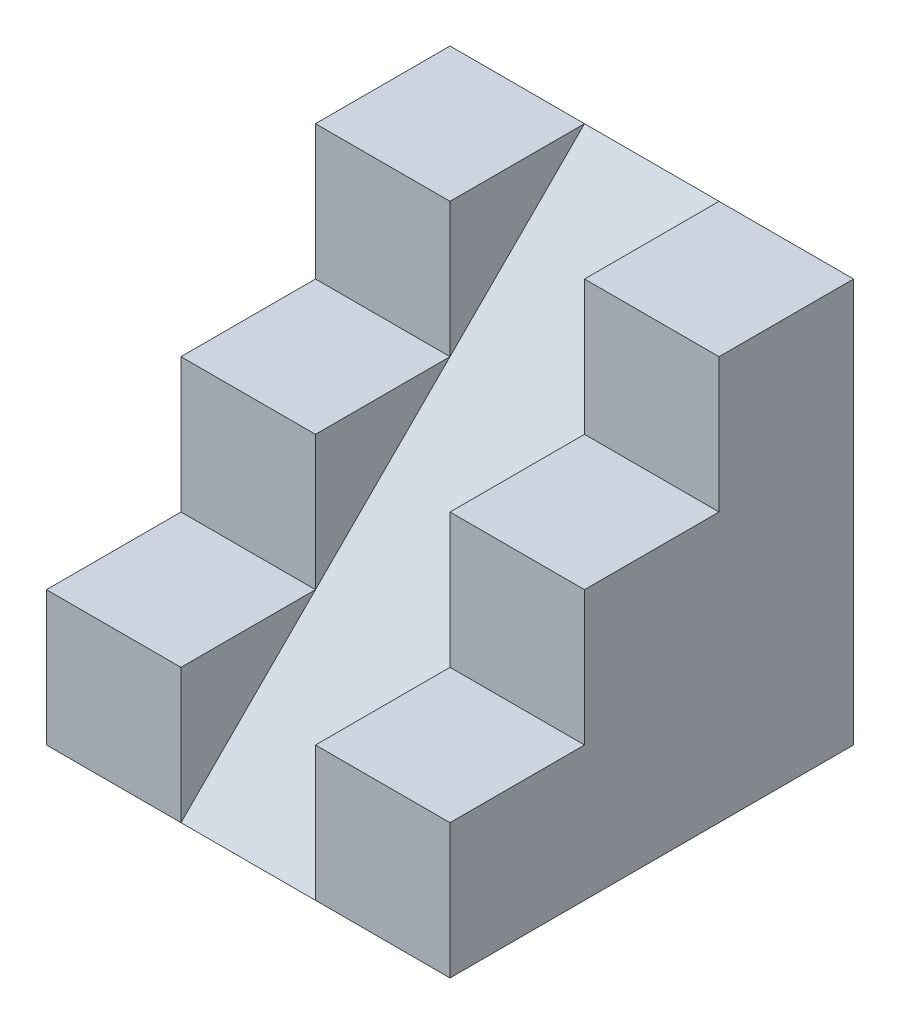
ISO-10303-21;
HEADER;
FILE_DESCRIPTION(('STEP AP214'),'2;1');
FILE_NAME('part.step','',(''),(''),'','','');
FILE_SCHEMA(('AUTOMOTIVE_DESIGN { 1 0 10303 214 1 1 1 1 }'));
ENDSEC;
DATA;
#1=APPLICATION_CONTEXT('core data for automotive mechanical design processes');
#2=APPLICATION_PROTOCOL_DEFINITION('international standard','automotive_design',2000,#1);
#3=PRODUCT_CONTEXT('',#1,'mechanical');
#4=PRODUCT('Part','Part','',(#3));
#5=PRODUCT_RELATED_PRODUCT_CATEGORY('part','',(#4));
#6=PRODUCT_DEFINITION_FORMATION('','',#4);
#7=PRODUCT_DEFINITION_CONTEXT('part definition',#1,'design');
#8=PRODUCT_DEFINITION('design','',#6,#7);
#9=PRODUCT_DEFINITION_SHAPE('','',#8);
#10=(LENGTH_UNIT() NAMED_UNIT(*) SI_UNIT(.MILLI.,.METRE.));
#11=(NAMED_UNIT(*) PLANE_ANGLE_UNIT() SI_UNIT($,.RADIAN.));
#12=(NAMED_UNIT(*) SI_UNIT($,.STERADIAN.) SOLID_ANGLE_UNIT());
#13=UNCERTAINTY_MEASURE_WITH_UNIT(LENGTH_MEASURE(1.E-05),#10,'distance_accuracy_value','');
#14=(GEOMETRIC_REPRESENTATION_CONTEXT(3) GLOBAL_UNCERTAINTY_ASSIGNED_CONTEXT((#13)) GLOBAL_UNIT_ASSIGNED_CONTEXT((#10,
#11,#12)) REPRESENTATION_CONTEXT('',''));
#15=CARTESIAN_POINT('',(0.,0.,0.));
#16=DIRECTION('',(0.,0.,1.));
#17=DIRECTION('',(1.,0.,0.));
#18=AXIS2_PLACEMENT_3D('',#15,#16,#17);
#19=CARTESIAN_POINT('',(10.,0.,30.));
#20=DIRECTION('',(1.,0.,0.));
#21=DIRECTION('',(0.,0.,-1.));
#22=AXIS2_PLACEMENT_3D('',#19,#20,#21);
#23=PLANE('',#22);
#24=DIRECTION('',(0.,1.,0.));
#25=VECTOR('',#24,1.);
#26=CARTESIAN_POINT('',(10.,0.,-30.));
#27=LINE('',#26,#25);
#28=CARTESIAN_POINT('',(10.,0.,-30.));
#29=VERTEX_POINT('',#28);
#30=CARTESIAN_POINT('',(10.,60.,-30.));
#31=VERTEX_POINT('',#30);
#32=EDGE_CURVE('E89',#29,#31,#27,.T.);
#33=ORIENTED_EDGE('',*,*,#32,.T.);
#34=DIRECTION('',(0.,0.707106781186547,-0.707106781186548));
#35=VECTOR('',#34,1.);
#36=CARTESIAN_POINT('',(10.,0.,30.));
#37=LINE('',#36,#35);
#38=CARTESIAN_POINT('',(10.,0.,30.));
#39=VERTEX_POINT('',#38);
#40=EDGE_CURVE('E62',#31,#39,#37,.F.);
#41=ORIENTED_EDGE('',*,*,#40,.T.);
#42=DIRECTION('',(0.,0.,-1.));
#43=VECTOR('',#42,1.);
#44=CARTESIAN_POINT('',(10.,0.,30.));
#45=LINE('',#44,#43);
#46=EDGE_CURVE('E103',#39,#29,#45,.T.);
#47=ORIENTED_EDGE('',*,*,#46,.T.);
#48=EDGE_LOOP('',(#33,#41,#47));
#49=FACE_BOUND('',#48,.T.);
#50=ADVANCED_FACE('F52',(#49),#23,.T.);
#51=CARTESIAN_POINT('',(-10.,0.,-30.));
#52=DIRECTION('',(-1.,0.,0.));
#53=DIRECTION('',(0.,0.,1.));
#54=AXIS2_PLACEMENT_3D('',#51,#52,#53);
#55=PLANE('',#54);
#56=DIRECTION('',(0.,0.,1.));
#57=VECTOR('',#56,1.);
#58=CARTESIAN_POINT('',(-10.,0.,-30.));
#59=LINE('',#58,#57);
#60=CARTESIAN_POINT('',(-10.,0.,-30.));
#61=VERTEX_POINT('',#60);
#62=CARTESIAN_POINT('',(-10.,0.,30.));
#63=VERTEX_POINT('',#62);
#64=EDGE_CURVE('E94',#61,#63,#59,.T.);
#65=ORIENTED_EDGE('',*,*,#64,.T.);
#66=DIRECTION('',(0.,-0.707106781186547,0.707106781186548));
#67=VECTOR('',#66,1.);
#68=CARTESIAN_POINT('',(-10.,30.,0.));
#69=LINE('',#68,#67);
#70=CARTESIAN_POINT('',(-10.,60.,-30.));
#71=VERTEX_POINT('',#70);
#72=EDGE_CURVE('E12',#63,#71,#69,.F.);
#73=ORIENTED_EDGE('',*,*,#72,.T.);
#74=DIRECTION('',(0.,1.,0.));
#75=VECTOR('',#74,1.);
#76=CARTESIAN_POINT('',(-10.,0.,-30.));
#77=LINE('',#76,#75);
#78=EDGE_CURVE('E91',#61,#71,#77,.T.);
#79=ORIENTED_EDGE('',*,*,#78,.F.);
#80=EDGE_LOOP('',(#65,#73,#79));
#81=FACE_BOUND('',#80,.T.);
#82=ADVANCED_FACE('F93',(#81),#55,.T.);
#83=CARTESIAN_POINT('',(10.,0.,-30.));
#84=DIRECTION('',(0.,0.,-1.));
#85=DIRECTION('',(-1.,0.,0.));
#86=AXIS2_PLACEMENT_3D('',#83,#84,#85);
#87=PLANE('',#86);
#88=DIRECTION('',(-1.,0.,0.));
#89=VECTOR('',#88,1.);
#90=CARTESIAN_POINT('',(10.,60.,-30.));
#91=LINE('',#90,#89);
#92=EDGE_CURVE('E105',#31,#71,#91,.T.);
#93=ORIENTED_EDGE('',*,*,#92,.F.);
#94=ORIENTED_EDGE('',*,*,#32,.F.);
#95=DIRECTION('',(-1.,0.,0.));
#96=VECTOR('',#95,1.);
#97=CARTESIAN_POINT('',(10.,0.,-30.));
#98=LINE('',#97,#96);
#99=EDGE_CURVE('E99',#29,#61,#98,.T.);
#100=ORIENTED_EDGE('',*,*,#99,.T.);
#101=ORIENTED_EDGE('',*,*,#78,.T.);
#102=EDGE_LOOP('',(#93,#94,#100,#101));
#103=FACE_BOUND('',#102,.T.);
#104=ADVANCED_FACE('F102',(#103),#87,.T.);
#105=CARTESIAN_POINT('',(0.,0.,0.));
#106=DIRECTION('',(0.,1.,0.));
#107=DIRECTION('',(0.,0.,1.));
#108=AXIS2_PLACEMENT_3D('',#105,#106,#107);
#109=PLANE('',#108);
#110=ORIENTED_EDGE('',*,*,#46,.F.);
#111=DIRECTION('',(1.,0.,0.));
#112=VECTOR('',#111,1.);
#113=CARTESIAN_POINT('',(-10.,0.,30.));
#114=LINE('',#113,#112);
#115=EDGE_CURVE('E100',#63,#39,#114,.T.);
#116=ORIENTED_EDGE('',*,*,#115,.F.);
#117=ORIENTED_EDGE('',*,*,#64,.F.);
#118=ORIENTED_EDGE('',*,*,#99,.F.);
#119=EDGE_LOOP('',(#110,#116,#117,#118));
#120=FACE_BOUND('',#119,.T.);
#121=ADVANCED_FACE('F98',(#120),#109,.F.);
#122=CARTESIAN_POINT('',(0.,60.,-30.0000000000002));
#123=DIRECTION('',(0.,-0.707106781186548,-0.707106781186547));
#124=DIRECTION('',(1.,0.,0.));
#125=AXIS2_PLACEMENT_3D('',#122,#123,#124);
#126=PLANE('',#125);
#127=ORIENTED_EDGE('',*,*,#72,.F.);
#128=ORIENTED_EDGE('',*,*,#115,.T.);
#129=ORIENTED_EDGE('',*,*,#40,.F.);
#130=ORIENTED_EDGE('',*,*,#92,.T.);
#131=EDGE_LOOP('',(#127,#128,#129,#130));
#132=FACE_BOUND('',#131,.T.);
#133=ADVANCED_FACE('F55',(#132),#126,.F.);
#134=CLOSED_SHELL('',(#50,#82,#104,#121,#133));
#135=MANIFOLD_SOLID_BREP('B2',#134);
#136=CARTESIAN_POINT('',(0.,20.,0.));
#137=DIRECTION('',(0.,-1.,0.));
#138=DIRECTION('',(0.,0.,-1.));
#139=AXIS2_PLACEMENT_3D('',#136,#137,#138);
#140=PLANE('',#139);
#141=DIRECTION('',(1.,0.,0.));
#142=VECTOR('',#141,1.);
#143=CARTESIAN_POINT('',(10.,20.,9.99999999999999));
#144=LINE('',#143,#142);
#145=CARTESIAN_POINT('',(10.,20.,9.99999999999999));
#146=VERTEX_POINT('',#145);
#147=CARTESIAN_POINT('',(30.,20.,10.));
#148=VERTEX_POINT('',#147);
#149=EDGE_CURVE('E185',#146,#148,#144,.T.);
#150=ORIENTED_EDGE('',*,*,#149,.F.);
#151=DIRECTION('',(0.,0.,1.));
#152=VECTOR('',#151,1.);
#153=CARTESIAN_POINT('',(10.,20.,30.));
#154=LINE('',#153,#152);
#155=CARTESIAN_POINT('',(10.,20.,30.));
#156=VERTEX_POINT('',#155);
#157=EDGE_CURVE('E272',#146,#156,#154,.T.);
#158=ORIENTED_EDGE('',*,*,#157,.T.);
#159=DIRECTION('',(1.,0.,0.));
#160=VECTOR('',#159,1.);
#161=CARTESIAN_POINT('',(30.,20.,30.));
#162=LINE('',#161,#160);
#163=CARTESIAN_POINT('',(30.,20.,30.));
#164=VERTEX_POINT('',#163);
#165=EDGE_CURVE('E275',#156,#164,#162,.T.);
#166=ORIENTED_EDGE('',*,*,#165,.T.);
#167=DIRECTION('',(0.,0.,-1.));
#168=VECTOR('',#167,1.);
#169=CARTESIAN_POINT('',(30.,20.,-30.));
#170=LINE('',#169,#168);
#171=EDGE_CURVE('E270',#164,#148,#170,.T.);
#172=ORIENTED_EDGE('',*,*,#171,.T.);
#173=EDGE_LOOP('',(#150,#158,#166,#172));
#174=FACE_BOUND('',#173,.T.);
#175=ADVANCED_FACE('F162',(#174),#140,.F.);
#176=CARTESIAN_POINT('',(30.,20.,-30.));
#177=DIRECTION('',(-1.,0.,0.));
#178=DIRECTION('',(0.,0.,1.));
#179=AXIS2_PLACEMENT_3D('',#176,#177,#178);
#180=PLANE('',#179);
#181=DIRECTION('',(0.,0.,-1.));
#182=VECTOR('',#181,1.);
#183=CARTESIAN_POINT('',(30.,0.,-30.));
#184=LINE('',#183,#182);
#185=CARTESIAN_POINT('',(30.,0.,30.));
#186=VERTEX_POINT('',#185);
#187=CARTESIAN_POINT('',(30.,0.,-30.));
#188=VERTEX_POINT('',#187);
#189=EDGE_CURVE('E233',#186,#188,#184,.T.);
#190=ORIENTED_EDGE('',*,*,#189,.T.);
#191=DIRECTION('',(0.,-1.,0.));
#192=VECTOR('',#191,1.);
#193=CARTESIAN_POINT('',(30.,20.,-30.));
#194=LINE('',#193,#192);
#195=CARTESIAN_POINT('',(30.,60.,-30.));
#196=VERTEX_POINT('',#195);
#197=EDGE_CURVE('E50',#196,#188,#194,.T.);
#198=ORIENTED_EDGE('',*,*,#197,.F.);
#199=DIRECTION('',(0.,0.,-1.));
#200=VECTOR('',#199,1.);
#201=CARTESIAN_POINT('',(30.,60.,-10.));
#202=LINE('',#201,#200);
#203=CARTESIAN_POINT('',(30.,60.,-10.));
#204=VERTEX_POINT('',#203);
#205=EDGE_CURVE('E230',#204,#196,#202,.T.);
#206=ORIENTED_EDGE('',*,*,#205,.F.);
#207=DIRECTION('',(0.,-1.,0.));
#208=VECTOR('',#207,1.);
#209=CARTESIAN_POINT('',(30.,60.,-10.));
#210=LINE('',#209,#208);
#211=CARTESIAN_POINT('',(30.,40.,-10.));
#212=VERTEX_POINT('',#211);
#213=EDGE_CURVE('E251',#204,#212,#210,.T.);
#214=ORIENTED_EDGE('',*,*,#213,.T.);
#215=DIRECTION('',(0.,0.,-1.));
#216=VECTOR('',#215,1.);
#217=CARTESIAN_POINT('',(30.,40.,10.));
#218=LINE('',#217,#216);
#219=CARTESIAN_POINT('',(30.,40.,10.));
#220=VERTEX_POINT('',#219);
#221=EDGE_CURVE('E257',#220,#212,#218,.T.);
#222=ORIENTED_EDGE('',*,*,#221,.F.);
#223=DIRECTION('',(0.,-1.,0.));
#224=VECTOR('',#223,1.);
#225=CARTESIAN_POINT('',(30.,40.,10.));
#226=LINE('',#225,#224);
#227=EDGE_CURVE('E263',#220,#148,#226,.T.);
#228=ORIENTED_EDGE('',*,*,#227,.T.);
#229=ORIENTED_EDGE('',*,*,#171,.F.);
#230=DIRECTION('',(0.,-1.,0.));
#231=VECTOR('',#230,1.);
#232=CARTESIAN_POINT('',(30.,20.,30.));
#233=LINE('',#232,#231);
#234=EDGE_CURVE('E277',#164,#186,#233,.T.);
#235=ORIENTED_EDGE('',*,*,#234,.T.);
#236=EDGE_LOOP('',(#190,#198,#206,#214,#222,#228,#229,#235));
#237=FACE_BOUND('',#236,.T.);
#238=ADVANCED_FACE('F164',(#237),#180,.F.);
#239=CARTESIAN_POINT('',(30.,20.,-30.));
#240=DIRECTION('',(0.,0.,1.));
#241=DIRECTION('',(1.,0.,0.));
#242=AXIS2_PLACEMENT_3D('',#239,#240,#241);
#243=PLANE('',#242);
#244=DIRECTION('',(-1.,0.,0.));
#245=VECTOR('',#244,1.);
#246=CARTESIAN_POINT('',(30.,0.,-30.));
#247=LINE('',#246,#245);
#248=CARTESIAN_POINT('',(10.,0.,-30.));
#249=VERTEX_POINT('',#248);
#250=EDGE_CURVE('E279',#188,#249,#247,.T.);
#251=ORIENTED_EDGE('',*,*,#250,.T.);
#252=DIRECTION('',(0.,-1.,0.));
#253=VECTOR('',#252,1.);
#254=CARTESIAN_POINT('',(10.,20.,-30.));
#255=LINE('',#254,#253);
#256=CARTESIAN_POINT('',(10.,60.,-30.));
#257=VERTEX_POINT('',#256);
#258=EDGE_CURVE('E170',#257,#249,#255,.T.);
#259=ORIENTED_EDGE('',*,*,#258,.F.);
#260=DIRECTION('',(-1.,0.,0.));
#261=VECTOR('',#260,1.);
#262=CARTESIAN_POINT('',(30.,60.,-30.));
#263=LINE('',#262,#261);
#264=EDGE_CURVE('E236',#196,#257,#263,.T.);
#265=ORIENTED_EDGE('',*,*,#264,.F.);
#266=ORIENTED_EDGE('',*,*,#197,.T.);
#267=EDGE_LOOP('',(#251,#259,#265,#266));
#268=FACE_BOUND('',#267,.T.);
#269=ADVANCED_FACE('F237',(#268),#243,.F.);
#270=CARTESIAN_POINT('',(10.,20.,30.));
#271=DIRECTION('',(1.,0.,0.));
#272=DIRECTION('',(0.,0.,-1.));
#273=AXIS2_PLACEMENT_3D('',#270,#271,#272);
#274=PLANE('',#273);
#275=DIRECTION('',(0.,0.,1.));
#276=VECTOR('',#275,1.);
#277=CARTESIAN_POINT('',(10.,0.,30.));
#278=LINE('',#277,#276);
#279=CARTESIAN_POINT('',(10.,0.,30.));
#280=VERTEX_POINT('',#279);
#281=EDGE_CURVE('E281',#249,#280,#278,.T.);
#282=ORIENTED_EDGE('',*,*,#281,.T.);
#283=DIRECTION('',(0.,-1.,0.));
#284=VECTOR('',#283,1.);
#285=CARTESIAN_POINT('',(10.,20.,30.));
#286=LINE('',#285,#284);
#287=EDGE_CURVE('E285',#156,#280,#286,.T.);
#288=ORIENTED_EDGE('',*,*,#287,.F.);
#289=ORIENTED_EDGE('',*,*,#157,.F.);
#290=DIRECTION('',(0.,-1.,0.));
#291=VECTOR('',#290,1.);
#292=CARTESIAN_POINT('',(10.,40.,9.99999999999999));
#293=LINE('',#292,#291);
#294=CARTESIAN_POINT('',(10.,40.,9.99999999999999));
#295=VERTEX_POINT('',#294);
#296=EDGE_CURVE('E267',#295,#146,#293,.T.);
#297=ORIENTED_EDGE('',*,*,#296,.F.);
#298=DIRECTION('',(0.,0.,1.));
#299=VECTOR('',#298,1.);
#300=CARTESIAN_POINT('',(10.,40.,-30.));
#301=LINE('',#300,#299);
#302=CARTESIAN_POINT('',(10.,40.,-10.));
#303=VERTEX_POINT('',#302);
#304=EDGE_CURVE('E259',#303,#295,#301,.T.);
#305=ORIENTED_EDGE('',*,*,#304,.F.);
#306=DIRECTION('',(0.,-1.,0.));
#307=VECTOR('',#306,1.);
#308=CARTESIAN_POINT('',(10.,60.,-10.));
#309=LINE('',#308,#307);
#310=CARTESIAN_POINT('',(10.,60.,-10.));
#311=VERTEX_POINT('',#310);
#312=EDGE_CURVE('E254',#311,#303,#309,.T.);
#313=ORIENTED_EDGE('',*,*,#312,.F.);
#314=DIRECTION('',(0.,0.,1.));
#315=VECTOR('',#314,1.);
#316=CARTESIAN_POINT('',(10.,60.,-30.));
#317=LINE('',#316,#315);
#318=EDGE_CURVE('E241',#257,#311,#317,.T.);
#319=ORIENTED_EDGE('',*,*,#318,.F.);
#320=ORIENTED_EDGE('',*,*,#258,.T.);
#321=EDGE_LOOP('',(#282,#288,#289,#297,#305,#313,#319,#320));
#322=FACE_BOUND('',#321,.T.);
#323=ADVANCED_FACE('F289',(#322),#274,.F.);
#324=CARTESIAN_POINT('',(30.,20.,30.));
#325=DIRECTION('',(0.,0.,-1.));
#326=DIRECTION('',(-1.,0.,0.));
#327=AXIS2_PLACEMENT_3D('',#324,#325,#326);
#328=PLANE('',#327);
#329=DIRECTION('',(1.,0.,0.));
#330=VECTOR('',#329,1.);
#331=CARTESIAN_POINT('',(30.,0.,30.));
#332=LINE('',#331,#330);
#333=EDGE_CURVE('E273',#280,#186,#332,.T.);
#334=ORIENTED_EDGE('',*,*,#333,.T.);
#335=ORIENTED_EDGE('',*,*,#234,.F.);
#336=ORIENTED_EDGE('',*,*,#165,.F.);
#337=ORIENTED_EDGE('',*,*,#287,.T.);
#338=EDGE_LOOP('',(#334,#335,#336,#337));
#339=FACE_BOUND('',#338,.T.);
#340=ADVANCED_FACE('F297',(#339),#328,.F.);
#341=CARTESIAN_POINT('',(0.,0.,0.));
#342=DIRECTION('',(0.,-1.,0.));
#343=DIRECTION('',(0.,0.,-1.));
#344=AXIS2_PLACEMENT_3D('',#341,#342,#343);
#345=PLANE('',#344);
#346=ORIENTED_EDGE('',*,*,#189,.F.);
#347=ORIENTED_EDGE('',*,*,#333,.F.);
#348=ORIENTED_EDGE('',*,*,#281,.F.);
#349=ORIENTED_EDGE('',*,*,#250,.F.);
#350=EDGE_LOOP('',(#346,#347,#348,#349));
#351=FACE_BOUND('',#350,.T.);
#352=ADVANCED_FACE('F294',(#351),#345,.T.);
#353=CARTESIAN_POINT('',(10.,40.,9.99999999999999));
#354=DIRECTION('',(0.,0.,-1.));
#355=DIRECTION('',(-1.,0.,0.));
#356=AXIS2_PLACEMENT_3D('',#353,#354,#355);
#357=PLANE('',#356);
#358=ORIENTED_EDGE('',*,*,#149,.T.);
#359=ORIENTED_EDGE('',*,*,#227,.F.);
#360=DIRECTION('',(1.,0.,0.));
#361=VECTOR('',#360,1.);
#362=CARTESIAN_POINT('',(10.,40.,9.99999999999999));
#363=LINE('',#362,#361);
#364=EDGE_CURVE('E261',#295,#220,#363,.T.);
#365=ORIENTED_EDGE('',*,*,#364,.F.);
#366=ORIENTED_EDGE('',*,*,#296,.T.);
#367=EDGE_LOOP('',(#358,#359,#365,#366));
#368=FACE_BOUND('',#367,.T.);
#369=ADVANCED_FACE('F303',(#368),#357,.F.);
#370=CARTESIAN_POINT('',(0.,40.,0.));
#371=DIRECTION('',(0.,1.,0.));
#372=DIRECTION('',(0.,0.,1.));
#373=AXIS2_PLACEMENT_3D('',#370,#371,#372);
#374=PLANE('',#373);
#375=DIRECTION('',(1.,0.,0.));
#376=VECTOR('',#375,1.);
#377=CARTESIAN_POINT('',(10.,40.,-10.));
#378=LINE('',#377,#376);
#379=EDGE_CURVE('E177',#303,#212,#378,.T.);
#380=ORIENTED_EDGE('',*,*,#379,.F.);
#381=ORIENTED_EDGE('',*,*,#304,.T.);
#382=ORIENTED_EDGE('',*,*,#364,.T.);
#383=ORIENTED_EDGE('',*,*,#221,.T.);
#384=EDGE_LOOP('',(#380,#381,#382,#383));
#385=FACE_BOUND('',#384,.T.);
#386=ADVANCED_FACE('F308',(#385),#374,.T.);
#387=CARTESIAN_POINT('',(10.,60.,-10.));
#388=DIRECTION('',(0.,0.,-1.));
#389=DIRECTION('',(-1.,0.,0.));
#390=AXIS2_PLACEMENT_3D('',#387,#388,#389);
#391=PLANE('',#390);
#392=ORIENTED_EDGE('',*,*,#379,.T.);
#393=ORIENTED_EDGE('',*,*,#213,.F.);
#394=DIRECTION('',(1.,0.,0.));
#395=VECTOR('',#394,1.);
#396=CARTESIAN_POINT('',(10.,60.,-10.));
#397=LINE('',#396,#395);
#398=EDGE_CURVE('E245',#311,#204,#397,.T.);
#399=ORIENTED_EDGE('',*,*,#398,.F.);
#400=ORIENTED_EDGE('',*,*,#312,.T.);
#401=EDGE_LOOP('',(#392,#393,#399,#400));
#402=FACE_BOUND('',#401,.T.);
#403=ADVANCED_FACE('F307',(#402),#391,.F.);
#404=CARTESIAN_POINT('',(0.,60.,0.));
#405=DIRECTION('',(0.,1.,0.));
#406=DIRECTION('',(0.,0.,1.));
#407=AXIS2_PLACEMENT_3D('',#404,#405,#406);
#408=PLANE('',#407);
#409=ORIENTED_EDGE('',*,*,#205,.T.);
#410=ORIENTED_EDGE('',*,*,#264,.T.);
#411=ORIENTED_EDGE('',*,*,#318,.T.);
#412=ORIENTED_EDGE('',*,*,#398,.T.);
#413=EDGE_LOOP('',(#409,#410,#411,#412));
#414=FACE_BOUND('',#413,.T.);
#415=ADVANCED_FACE('F243',(#414),#408,.T.);
#416=CLOSED_SHELL('',(#175,#238,#269,#323,#340,#352,#369,#386,#403,#415));
#417=MANIFOLD_SOLID_BREP('B6',#416);
#418=CARTESIAN_POINT('',(-10.,20.,30.));
#419=DIRECTION('',(0.,0.,-1.));
#420=DIRECTION('',(-1.,0.,0.));
#421=AXIS2_PLACEMENT_3D('',#418,#419,#420);
#422=PLANE('',#421);
#423=DIRECTION('',(1.,0.,0.));
#424=VECTOR('',#423,1.);
#425=CARTESIAN_POINT('',(-10.,0.,30.));
#426=LINE('',#425,#424);
#427=CARTESIAN_POINT('',(-30.,0.,30.));
#428=VERTEX_POINT('',#427);
#429=CARTESIAN_POINT('',(-10.,0.,30.));
#430=VERTEX_POINT('',#429);
#431=EDGE_CURVE('E531',#428,#430,#426,.T.);
#432=ORIENTED_EDGE('',*,*,#431,.T.);
#433=DIRECTION('',(0.,-1.,0.));
#434=VECTOR('',#433,1.);
#435=CARTESIAN_POINT('',(-10.,20.,30.));
#436=LINE('',#435,#434);
#437=CARTESIAN_POINT('',(-10.,20.,30.));
#438=VERTEX_POINT('',#437);
#439=EDGE_CURVE('E160',#438,#430,#436,.T.);
#440=ORIENTED_EDGE('',*,*,#439,.F.);
#441=DIRECTION('',(1.,0.,0.));
#442=VECTOR('',#441,1.);
#443=CARTESIAN_POINT('',(-10.,20.,30.));
#444=LINE('',#443,#442);
#445=CARTESIAN_POINT('',(-30.,20.,30.));
#446=VERTEX_POINT('',#445);
#447=EDGE_CURVE('E532',#446,#438,#444,.T.);
#448=ORIENTED_EDGE('',*,*,#447,.F.);
#449=DIRECTION('',(0.,-1.,0.));
#450=VECTOR('',#449,1.);
#451=CARTESIAN_POINT('',(-30.,20.,30.));
#452=LINE('',#451,#450);
#453=EDGE_CURVE('E543',#446,#428,#452,.T.);
#454=ORIENTED_EDGE('',*,*,#453,.T.);
#455=EDGE_LOOP('',(#432,#440,#448,#454));
#456=FACE_BOUND('',#455,.T.);
#457=ADVANCED_FACE('F408',(#456),#422,.F.);
#458=CARTESIAN_POINT('',(-10.,20.,30.));
#459=DIRECTION('',(-1.,0.,0.));
#460=DIRECTION('',(0.,0.,1.));
#461=AXIS2_PLACEMENT_3D('',#458,#459,#460);
#462=PLANE('',#461);
#463=DIRECTION('',(0.,0.,-1.));
#464=VECTOR('',#463,1.);
#465=CARTESIAN_POINT('',(-10.,0.,30.));
#466=LINE('',#465,#464);
#467=CARTESIAN_POINT('',(-10.,0.,-30.));
#468=VERTEX_POINT('',#467);
#469=EDGE_CURVE('E478',#430,#468,#466,.T.);
#470=ORIENTED_EDGE('',*,*,#469,.T.);
#471=DIRECTION('',(0.,-1.,0.));
#472=VECTOR('',#471,1.);
#473=CARTESIAN_POINT('',(-10.,20.,-30.));
#474=LINE('',#473,#472);
#475=CARTESIAN_POINT('',(-10.,60.,-30.));
#476=VERTEX_POINT('',#475);
#477=EDGE_CURVE('E416',#476,#468,#474,.T.);
#478=ORIENTED_EDGE('',*,*,#477,.F.);
#479=DIRECTION('',(0.,0.,-1.));
#480=VECTOR('',#479,1.);
#481=CARTESIAN_POINT('',(-10.,60.,-9.99999999999999));
#482=LINE('',#481,#480);
#483=CARTESIAN_POINT('',(-10.,60.,-9.99999999999999));
#484=VERTEX_POINT('',#483);
#485=EDGE_CURVE('E477',#484,#476,#482,.T.);
#486=ORIENTED_EDGE('',*,*,#485,.F.);
#487=DIRECTION('',(0.,-1.,0.));
#488=VECTOR('',#487,1.);
#489=CARTESIAN_POINT('',(-10.,60.,-9.99999999999999));
#490=LINE('',#489,#488);
#491=CARTESIAN_POINT('',(-10.,40.,-9.99999999999999));
#492=VERTEX_POINT('',#491);
#493=EDGE_CURVE('E504',#484,#492,#490,.T.);
#494=ORIENTED_EDGE('',*,*,#493,.T.);
#495=DIRECTION('',(0.,0.,-1.));
#496=VECTOR('',#495,1.);
#497=CARTESIAN_POINT('',(-10.,40.,10.));
#498=LINE('',#497,#496);
#499=CARTESIAN_POINT('',(-10.,40.,10.));
#500=VERTEX_POINT('',#499);
#501=EDGE_CURVE('E512',#500,#492,#498,.T.);
#502=ORIENTED_EDGE('',*,*,#501,.F.);
#503=DIRECTION('',(0.,-1.,0.));
#504=VECTOR('',#503,1.);
#505=CARTESIAN_POINT('',(-10.,40.,10.));
#506=LINE('',#505,#504);
#507=CARTESIAN_POINT('',(-10.,20.,10.));
#508=VERTEX_POINT('',#507);
#509=EDGE_CURVE('E521',#500,#508,#506,.T.);
#510=ORIENTED_EDGE('',*,*,#509,.T.);
#511=DIRECTION('',(0.,0.,-1.));
#512=VECTOR('',#511,1.);
#513=CARTESIAN_POINT('',(-10.,20.,30.));
#514=LINE('',#513,#512);
#515=EDGE_CURVE('E536',#438,#508,#514,.T.);
#516=ORIENTED_EDGE('',*,*,#515,.F.);
#517=ORIENTED_EDGE('',*,*,#439,.T.);
#518=EDGE_LOOP('',(#470,#478,#486,#494,#502,#510,#516,#517));
#519=FACE_BOUND('',#518,.T.);
#520=ADVANCED_FACE('F474',(#519),#462,.F.);
#521=CARTESIAN_POINT('',(-10.,20.,-30.));
#522=DIRECTION('',(0.,0.,1.));
#523=DIRECTION('',(1.,0.,0.));
#524=AXIS2_PLACEMENT_3D('',#521,#522,#523);
#525=PLANE('',#524);
#526=DIRECTION('',(-1.,0.,0.));
#527=VECTOR('',#526,1.);
#528=CARTESIAN_POINT('',(-10.,0.,-30.));
#529=LINE('',#528,#527);
#530=CARTESIAN_POINT('',(-30.,0.,-30.));
#531=VERTEX_POINT('',#530);
#532=EDGE_CURVE('E549',#468,#531,#529,.T.);
#533=ORIENTED_EDGE('',*,*,#532,.T.);
#534=DIRECTION('',(0.,-1.,0.));
#535=VECTOR('',#534,1.);
#536=CARTESIAN_POINT('',(-30.,20.,-30.));
#537=LINE('',#536,#535);
#538=CARTESIAN_POINT('',(-30.,60.,-30.));
#539=VERTEX_POINT('',#538);
#540=EDGE_CURVE('E482',#539,#531,#537,.T.);
#541=ORIENTED_EDGE('',*,*,#540,.F.);
#542=DIRECTION('',(-1.,0.,0.));
#543=VECTOR('',#542,1.);
#544=CARTESIAN_POINT('',(-10.,60.,-30.));
#545=LINE('',#544,#543);
#546=EDGE_CURVE('E484',#476,#539,#545,.T.);
#547=ORIENTED_EDGE('',*,*,#546,.F.);
#548=ORIENTED_EDGE('',*,*,#477,.T.);
#549=EDGE_LOOP('',(#533,#541,#547,#548));
#550=FACE_BOUND('',#549,.T.);
#551=ADVANCED_FACE('F485',(#550),#525,.F.);
#552=CARTESIAN_POINT('',(-30.,20.,-30.));
#553=DIRECTION('',(1.,0.,0.));
#554=DIRECTION('',(0.,0.,-1.));
#555=AXIS2_PLACEMENT_3D('',#552,#553,#554);
#556=PLANE('',#555);
#557=DIRECTION('',(0.,0.,1.));
#558=VECTOR('',#557,1.);
#559=CARTESIAN_POINT('',(-30.,0.,-30.));
#560=LINE('',#559,#558);
#561=EDGE_CURVE('E537',#531,#428,#560,.T.);
#562=ORIENTED_EDGE('',*,*,#561,.T.);
#563=ORIENTED_EDGE('',*,*,#453,.F.);
#564=DIRECTION('',(0.,0.,1.));
#565=VECTOR('',#564,1.);
#566=CARTESIAN_POINT('',(-30.,20.,-30.));
#567=LINE('',#566,#565);
#568=CARTESIAN_POINT('',(-30.,20.,10.));
#569=VERTEX_POINT('',#568);
#570=EDGE_CURVE('E540',#569,#446,#567,.T.);
#571=ORIENTED_EDGE('',*,*,#570,.F.);
#572=DIRECTION('',(0.,-1.,0.));
#573=VECTOR('',#572,1.);
#574=CARTESIAN_POINT('',(-30.,40.,10.));
#575=LINE('',#574,#573);
#576=CARTESIAN_POINT('',(-30.,40.,10.));
#577=VERTEX_POINT('',#576);
#578=EDGE_CURVE('E527',#577,#569,#575,.T.);
#579=ORIENTED_EDGE('',*,*,#578,.F.);
#580=DIRECTION('',(0.,0.,1.));
#581=VECTOR('',#580,1.);
#582=CARTESIAN_POINT('',(-30.,40.,-30.));
#583=LINE('',#582,#581);
#584=CARTESIAN_POINT('',(-30.,40.,-9.99999999999999));
#585=VERTEX_POINT('',#584);
#586=EDGE_CURVE('E515',#585,#577,#583,.T.);
#587=ORIENTED_EDGE('',*,*,#586,.F.);
#588=DIRECTION('',(0.,-1.,0.));
#589=VECTOR('',#588,1.);
#590=CARTESIAN_POINT('',(-30.,60.,-9.99999999999999));
#591=LINE('',#590,#589);
#592=CARTESIAN_POINT('',(-30.,60.,-9.99999999999999));
#593=VERTEX_POINT('',#592);
#594=EDGE_CURVE('E508',#593,#585,#591,.T.);
#595=ORIENTED_EDGE('',*,*,#594,.F.);
#596=DIRECTION('',(0.,0.,1.));
#597=VECTOR('',#596,1.);
#598=CARTESIAN_POINT('',(-30.,60.,-30.));
#599=LINE('',#598,#597);
#600=EDGE_CURVE('E490',#539,#593,#599,.T.);
#601=ORIENTED_EDGE('',*,*,#600,.F.);
#602=ORIENTED_EDGE('',*,*,#540,.T.);
#603=EDGE_LOOP('',(#562,#563,#571,#579,#587,#595,#601,#602));
#604=FACE_BOUND('',#603,.T.);
#605=ADVANCED_FACE('F560',(#604),#556,.F.);
#606=CARTESIAN_POINT('',(0.,20.,0.));
#607=DIRECTION('',(0.,1.,0.));
#608=DIRECTION('',(0.,0.,1.));
#609=AXIS2_PLACEMENT_3D('',#606,#607,#608);
#610=PLANE('',#609);
#611=DIRECTION('',(1.,0.,0.));
#612=VECTOR('',#611,1.);
#613=CARTESIAN_POINT('',(-30.,20.,10.));
#614=LINE('',#613,#612);
#615=EDGE_CURVE('E431',#569,#508,#614,.T.);
#616=ORIENTED_EDGE('',*,*,#615,.F.);
#617=ORIENTED_EDGE('',*,*,#570,.T.);
#618=ORIENTED_EDGE('',*,*,#447,.T.);
#619=ORIENTED_EDGE('',*,*,#515,.T.);
#620=EDGE_LOOP('',(#616,#617,#618,#619));
#621=FACE_BOUND('',#620,.T.);
#622=ADVANCED_FACE('F578',(#621),#610,.T.);
#623=CARTESIAN_POINT('',(0.,0.,0.));
#624=DIRECTION('',(0.,1.,0.));
#625=DIRECTION('',(0.,0.,1.));
#626=AXIS2_PLACEMENT_3D('',#623,#624,#625);
#627=PLANE('',#626);
#628=ORIENTED_EDGE('',*,*,#431,.F.);
#629=ORIENTED_EDGE('',*,*,#561,.F.);
#630=ORIENTED_EDGE('',*,*,#532,.F.);
#631=ORIENTED_EDGE('',*,*,#469,.F.);
#632=EDGE_LOOP('',(#628,#629,#630,#631));
#633=FACE_BOUND('',#632,.T.);
#634=ADVANCED_FACE('F565',(#633),#627,.F.);
#635=CARTESIAN_POINT('',(-30.,40.,10.));
#636=DIRECTION('',(0.,0.,-1.));
#637=DIRECTION('',(-1.,0.,0.));
#638=AXIS2_PLACEMENT_3D('',#635,#636,#637);
#639=PLANE('',#638);
#640=ORIENTED_EDGE('',*,*,#615,.T.);
#641=ORIENTED_EDGE('',*,*,#509,.F.);
#642=DIRECTION('',(1.,0.,0.));
#643=VECTOR('',#642,1.);
#644=CARTESIAN_POINT('',(-30.,40.,10.));
#645=LINE('',#644,#643);
#646=EDGE_CURVE('E518',#577,#500,#645,.T.);
#647=ORIENTED_EDGE('',*,*,#646,.F.);
#648=ORIENTED_EDGE('',*,*,#578,.T.);
#649=EDGE_LOOP('',(#640,#641,#647,#648));
#650=FACE_BOUND('',#649,.T.);
#651=ADVANCED_FACE('F572',(#650),#639,.F.);
#652=CARTESIAN_POINT('',(0.,40.,0.));
#653=DIRECTION('',(0.,1.,0.));
#654=DIRECTION('',(0.,0.,1.));
#655=AXIS2_PLACEMENT_3D('',#652,#653,#654);
#656=PLANE('',#655);
#657=DIRECTION('',(1.,0.,0.));
#658=VECTOR('',#657,1.);
#659=CARTESIAN_POINT('',(-30.,40.,-9.99999999999999));
#660=LINE('',#659,#658);
#661=EDGE_CURVE('E423',#585,#492,#660,.T.);
#662=ORIENTED_EDGE('',*,*,#661,.F.);
#663=ORIENTED_EDGE('',*,*,#586,.T.);
#664=ORIENTED_EDGE('',*,*,#646,.T.);
#665=ORIENTED_EDGE('',*,*,#501,.T.);
#666=EDGE_LOOP('',(#662,#663,#664,#665));
#667=FACE_BOUND('',#666,.T.);
#668=ADVANCED_FACE('F575',(#667),#656,.T.);
#669=CARTESIAN_POINT('',(-30.,60.,-9.99999999999999));
#670=DIRECTION('',(0.,0.,-1.));
#671=DIRECTION('',(-1.,0.,0.));
#672=AXIS2_PLACEMENT_3D('',#669,#670,#671);
#673=PLANE('',#672);
#674=ORIENTED_EDGE('',*,*,#661,.T.);
#675=ORIENTED_EDGE('',*,*,#493,.F.);
#676=DIRECTION('',(1.,0.,0.));
#677=VECTOR('',#676,1.);
#678=CARTESIAN_POINT('',(-30.,60.,-9.99999999999999));
#679=LINE('',#678,#677);
#680=EDGE_CURVE('E494',#593,#484,#679,.T.);
#681=ORIENTED_EDGE('',*,*,#680,.F.);
#682=ORIENTED_EDGE('',*,*,#594,.T.);
#683=EDGE_LOOP('',(#674,#675,#681,#682));
#684=FACE_BOUND('',#683,.T.);
#685=ADVANCED_FACE('F577',(#684),#673,.F.);
#686=CARTESIAN_POINT('',(0.,60.,0.));
#687=DIRECTION('',(0.,1.,0.));
#688=DIRECTION('',(0.,0.,1.));
#689=AXIS2_PLACEMENT_3D('',#686,#687,#688);
#690=PLANE('',#689);
#691=ORIENTED_EDGE('',*,*,#485,.T.);
#692=ORIENTED_EDGE('',*,*,#546,.T.);
#693=ORIENTED_EDGE('',*,*,#600,.T.);
#694=ORIENTED_EDGE('',*,*,#680,.T.);
#695=EDGE_LOOP('',(#691,#692,#693,#694));
#696=FACE_BOUND('',#695,.T.);
#697=ADVANCED_FACE('F492',(#696),#690,.T.);
#698=CLOSED_SHELL('',(#457,#520,#551,#605,#622,#634,#651,#668,#685,#697));
#699=MANIFOLD_SOLID_BREP('B44',#698);
#700=ADVANCED_BREP_SHAPE_REPRESENTATION('',(#18,#135,#417,#699),#14);
#701=SHAPE_DEFINITION_REPRESENTATION(#9,#700);
ENDSEC;
END-ISO-10303-21;
